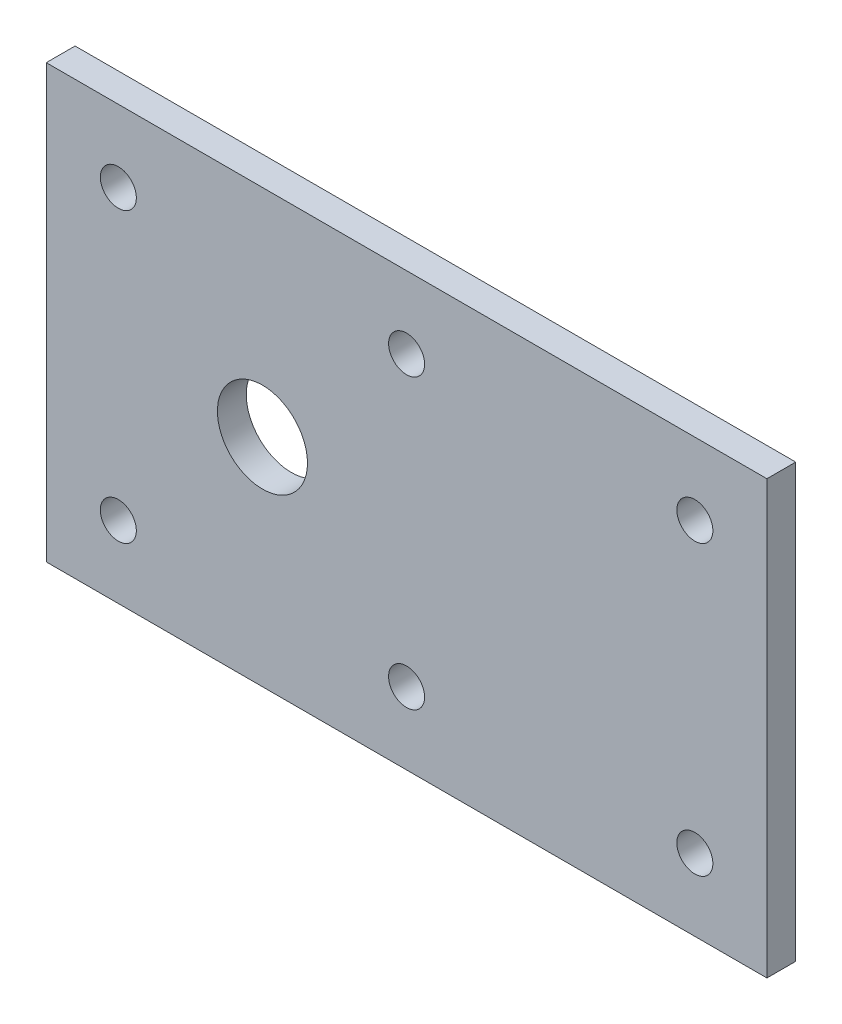
ISO-10303-21;
HEADER;
FILE_DESCRIPTION(('STEP AP214'),'2;1');
FILE_NAME('part.step','',(''),(''),'','','');
FILE_SCHEMA(('AUTOMOTIVE_DESIGN { 1 0 10303 214 1 1 1 1 }'));
ENDSEC;
DATA;
#1=APPLICATION_CONTEXT('core data for automotive mechanical design processes');
#2=APPLICATION_PROTOCOL_DEFINITION('international standard','automotive_design',2000,#1);
#3=PRODUCT_CONTEXT('',#1,'mechanical');
#4=PRODUCT('Part','Part','',(#3));
#5=PRODUCT_RELATED_PRODUCT_CATEGORY('part','',(#4));
#6=PRODUCT_DEFINITION_FORMATION('','',#4);
#7=PRODUCT_DEFINITION_CONTEXT('part definition',#1,'design');
#8=PRODUCT_DEFINITION('design','',#6,#7);
#9=PRODUCT_DEFINITION_SHAPE('','',#8);
#10=(LENGTH_UNIT() NAMED_UNIT(*) SI_UNIT(.MILLI.,.METRE.));
#11=(NAMED_UNIT(*) PLANE_ANGLE_UNIT() SI_UNIT($,.RADIAN.));
#12=(NAMED_UNIT(*) SI_UNIT($,.STERADIAN.) SOLID_ANGLE_UNIT());
#13=UNCERTAINTY_MEASURE_WITH_UNIT(LENGTH_MEASURE(1.E-05),#10,'distance_accuracy_value','');
#14=(GEOMETRIC_REPRESENTATION_CONTEXT(3) GLOBAL_UNCERTAINTY_ASSIGNED_CONTEXT((#13)) GLOBAL_UNIT_ASSIGNED_CONTEXT((#10,
#11,#12)) REPRESENTATION_CONTEXT('',''));
#15=CARTESIAN_POINT('',(0.,0.,0.));
#16=DIRECTION('',(0.,0.,1.));
#17=DIRECTION('',(1.,0.,0.));
#18=AXIS2_PLACEMENT_3D('',#15,#16,#17);
#19=CARTESIAN_POINT('',(120.,-40.,0.));
#20=DIRECTION('',(0.,0.,1.));
#21=DIRECTION('',(1.,0.,0.));
#22=AXIS2_PLACEMENT_3D('',#19,#20,#21);
#23=CYLINDRICAL_SURFACE('',#22,5.);
#24=CARTESIAN_POINT('',(120.,-40.,0.));
#25=DIRECTION('',(0.,0.,1.));
#26=DIRECTION('',(1.,0.,0.));
#27=AXIS2_PLACEMENT_3D('',#24,#25,#26);
#28=CIRCLE('',#27,5.);
#29=CARTESIAN_POINT('',(125.,-40.,0.));
#30=VERTEX_POINT('',#29);
#31=EDGE_CURVE('E41',#30,#30,#28,.T.);
#32=ORIENTED_EDGE('',*,*,#31,.F.);
#33=EDGE_LOOP('',(#32));
#34=FACE_BOUND('',#33,.T.);
#35=CARTESIAN_POINT('',(120.,-40.,8.));
#36=DIRECTION('',(0.,0.,1.));
#37=DIRECTION('',(1.,0.,0.));
#38=AXIS2_PLACEMENT_3D('',#35,#36,#37);
#39=CIRCLE('',#38,5.);
#40=CARTESIAN_POINT('',(125.,-40.,8.));
#41=VERTEX_POINT('',#40);
#42=EDGE_CURVE('E11',#41,#41,#39,.T.);
#43=ORIENTED_EDGE('',*,*,#42,.T.);
#44=EDGE_LOOP('',(#43));
#45=FACE_BOUND('',#44,.T.);
#46=ADVANCED_FACE('F33',(#34,#45),#23,.F.);
#47=CARTESIAN_POINT('',(40.,-40.,0.));
#48=DIRECTION('',(0.,0.,1.));
#49=DIRECTION('',(1.,0.,0.));
#50=AXIS2_PLACEMENT_3D('',#47,#48,#49);
#51=CYLINDRICAL_SURFACE('',#50,5.);
#52=CARTESIAN_POINT('',(40.,-40.,0.));
#53=DIRECTION('',(0.,0.,1.));
#54=DIRECTION('',(1.,0.,0.));
#55=AXIS2_PLACEMENT_3D('',#52,#53,#54);
#56=CIRCLE('',#55,5.);
#57=CARTESIAN_POINT('',(45.,-40.,0.));
#58=VERTEX_POINT('',#57);
#59=EDGE_CURVE('E123',#58,#58,#56,.T.);
#60=ORIENTED_EDGE('',*,*,#59,.F.);
#61=EDGE_LOOP('',(#60));
#62=FACE_BOUND('',#61,.T.);
#63=CARTESIAN_POINT('',(40.,-40.,8.));
#64=DIRECTION('',(0.,0.,1.));
#65=DIRECTION('',(1.,0.,0.));
#66=AXIS2_PLACEMENT_3D('',#63,#64,#65);
#67=CIRCLE('',#66,5.);
#68=CARTESIAN_POINT('',(45.,-40.,8.));
#69=VERTEX_POINT('',#68);
#70=EDGE_CURVE('E126',#69,#69,#67,.T.);
#71=ORIENTED_EDGE('',*,*,#70,.T.);
#72=EDGE_LOOP('',(#71));
#73=FACE_BOUND('',#72,.T.);
#74=ADVANCED_FACE('F135',(#62,#73),#51,.F.);
#75=CARTESIAN_POINT('',(-40.,-40.,0.));
#76=DIRECTION('',(0.,0.,1.));
#77=DIRECTION('',(1.,0.,0.));
#78=AXIS2_PLACEMENT_3D('',#75,#76,#77);
#79=CYLINDRICAL_SURFACE('',#78,5.);
#80=CARTESIAN_POINT('',(-40.,-40.,0.));
#81=DIRECTION('',(0.,0.,1.));
#82=DIRECTION('',(1.,0.,0.));
#83=AXIS2_PLACEMENT_3D('',#80,#81,#82);
#84=CIRCLE('',#83,5.);
#85=CARTESIAN_POINT('',(-35.,-40.,0.));
#86=VERTEX_POINT('',#85);
#87=EDGE_CURVE('E117',#86,#86,#84,.T.);
#88=ORIENTED_EDGE('',*,*,#87,.F.);
#89=EDGE_LOOP('',(#88));
#90=FACE_BOUND('',#89,.T.);
#91=CARTESIAN_POINT('',(-40.,-40.,8.));
#92=DIRECTION('',(0.,0.,1.));
#93=DIRECTION('',(1.,0.,0.));
#94=AXIS2_PLACEMENT_3D('',#91,#92,#93);
#95=CIRCLE('',#94,5.);
#96=CARTESIAN_POINT('',(-35.,-40.,8.));
#97=VERTEX_POINT('',#96);
#98=EDGE_CURVE('E120',#97,#97,#95,.T.);
#99=ORIENTED_EDGE('',*,*,#98,.T.);
#100=EDGE_LOOP('',(#99));
#101=FACE_BOUND('',#100,.T.);
#102=ADVANCED_FACE('F166',(#90,#101),#79,.F.);
#103=CARTESIAN_POINT('',(120.,40.,0.));
#104=DIRECTION('',(0.,0.,1.));
#105=DIRECTION('',(1.,0.,0.));
#106=AXIS2_PLACEMENT_3D('',#103,#104,#105);
#107=CYLINDRICAL_SURFACE('',#106,5.);
#108=CARTESIAN_POINT('',(120.,40.,0.));
#109=DIRECTION('',(0.,0.,1.));
#110=DIRECTION('',(1.,0.,0.));
#111=AXIS2_PLACEMENT_3D('',#108,#109,#110);
#112=CIRCLE('',#111,5.);
#113=CARTESIAN_POINT('',(125.,40.,0.));
#114=VERTEX_POINT('',#113);
#115=EDGE_CURVE('E111',#114,#114,#112,.T.);
#116=ORIENTED_EDGE('',*,*,#115,.F.);
#117=EDGE_LOOP('',(#116));
#118=FACE_BOUND('',#117,.T.);
#119=CARTESIAN_POINT('',(120.,40.,8.));
#120=DIRECTION('',(0.,0.,1.));
#121=DIRECTION('',(1.,0.,0.));
#122=AXIS2_PLACEMENT_3D('',#119,#120,#121);
#123=CIRCLE('',#122,5.);
#124=CARTESIAN_POINT('',(125.,40.,8.));
#125=VERTEX_POINT('',#124);
#126=EDGE_CURVE('E114',#125,#125,#123,.T.);
#127=ORIENTED_EDGE('',*,*,#126,.T.);
#128=EDGE_LOOP('',(#127));
#129=FACE_BOUND('',#128,.T.);
#130=ADVANCED_FACE('F162',(#118,#129),#107,.F.);
#131=CARTESIAN_POINT('',(-60.0000000000001,60.0000000000001,8.));
#132=DIRECTION('',(1.,0.,0.));
#133=DIRECTION('',(0.,0.,-1.));
#134=AXIS2_PLACEMENT_3D('',#131,#132,#133);
#135=PLANE('',#134);
#136=DIRECTION('',(0.,-1.,0.));
#137=VECTOR('',#136,1.);
#138=CARTESIAN_POINT('',(-60.0000000000001,60.0000000000001,0.));
#139=LINE('',#138,#137);
#140=CARTESIAN_POINT('',(-60.0000000000001,60.0000000000001,0.));
#141=VERTEX_POINT('',#140);
#142=CARTESIAN_POINT('',(-60.0000000000001,-60.0000000000001,0.));
#143=VERTEX_POINT('',#142);
#144=EDGE_CURVE('E101',#141,#143,#139,.T.);
#145=ORIENTED_EDGE('',*,*,#144,.T.);
#146=DIRECTION('',(0.,0.,-1.));
#147=VECTOR('',#146,1.);
#148=CARTESIAN_POINT('',(-60.0000000000001,-60.0000000000001,8.));
#149=LINE('',#148,#147);
#150=CARTESIAN_POINT('',(-60.0000000000001,-60.0000000000001,8.));
#151=VERTEX_POINT('',#150);
#152=EDGE_CURVE('E92',#151,#143,#149,.T.);
#153=ORIENTED_EDGE('',*,*,#152,.F.);
#154=DIRECTION('',(0.,-1.,0.));
#155=VECTOR('',#154,1.);
#156=CARTESIAN_POINT('',(-60.0000000000001,60.0000000000001,8.));
#157=LINE('',#156,#155);
#158=CARTESIAN_POINT('',(-60.0000000000001,60.0000000000001,8.));
#159=VERTEX_POINT('',#158);
#160=EDGE_CURVE('E86',#159,#151,#157,.T.);
#161=ORIENTED_EDGE('',*,*,#160,.F.);
#162=DIRECTION('',(0.,0.,-1.));
#163=VECTOR('',#162,1.);
#164=CARTESIAN_POINT('',(-60.0000000000001,60.0000000000001,8.));
#165=LINE('',#164,#163);
#166=EDGE_CURVE('E97',#159,#141,#165,.T.);
#167=ORIENTED_EDGE('',*,*,#166,.T.);
#168=EDGE_LOOP('',(#145,#153,#161,#167));
#169=FACE_BOUND('',#168,.T.);
#170=ADVANCED_FACE('F159',(#169),#135,.F.);
#171=CARTESIAN_POINT('',(-60.0000000000001,-60.0000000000001,8.));
#172=DIRECTION('',(0.,1.,0.));
#173=DIRECTION('',(0.,0.,1.));
#174=AXIS2_PLACEMENT_3D('',#171,#172,#173);
#175=PLANE('',#174);
#176=DIRECTION('',(1.,0.,0.));
#177=VECTOR('',#176,1.);
#178=CARTESIAN_POINT('',(-60.0000000000001,-60.0000000000001,0.));
#179=LINE('',#178,#177);
#180=CARTESIAN_POINT('',(140.,-60.0000000000001,0.));
#181=VERTEX_POINT('',#180);
#182=EDGE_CURVE('E91',#143,#181,#179,.T.);
#183=ORIENTED_EDGE('',*,*,#182,.T.);
#184=DIRECTION('',(0.,0.,-1.));
#185=VECTOR('',#184,1.);
#186=CARTESIAN_POINT('',(140.,-60.0000000000001,8.));
#187=LINE('',#186,#185);
#188=CARTESIAN_POINT('',(140.,-60.0000000000001,8.));
#189=VERTEX_POINT('',#188);
#190=EDGE_CURVE('E89',#189,#181,#187,.T.);
#191=ORIENTED_EDGE('',*,*,#190,.F.);
#192=DIRECTION('',(1.,0.,0.));
#193=VECTOR('',#192,1.);
#194=CARTESIAN_POINT('',(-60.0000000000001,-60.0000000000001,8.));
#195=LINE('',#194,#193);
#196=EDGE_CURVE('E80',#151,#189,#195,.T.);
#197=ORIENTED_EDGE('',*,*,#196,.F.);
#198=ORIENTED_EDGE('',*,*,#152,.T.);
#199=EDGE_LOOP('',(#183,#191,#197,#198));
#200=FACE_BOUND('',#199,.T.);
#201=ADVANCED_FACE('F90',(#200),#175,.F.);
#202=CARTESIAN_POINT('',(140.,60.0000000000001,8.));
#203=DIRECTION('',(-1.,0.,0.));
#204=DIRECTION('',(0.,0.,1.));
#205=AXIS2_PLACEMENT_3D('',#202,#203,#204);
#206=PLANE('',#205);
#207=DIRECTION('',(0.,1.,0.));
#208=VECTOR('',#207,1.);
#209=CARTESIAN_POINT('',(140.,60.0000000000001,0.));
#210=LINE('',#209,#208);
#211=CARTESIAN_POINT('',(140.,60.0000000000001,0.));
#212=VERTEX_POINT('',#211);
#213=EDGE_CURVE('E66',#181,#212,#210,.T.);
#214=ORIENTED_EDGE('',*,*,#213,.T.);
#215=DIRECTION('',(0.,0.,-1.));
#216=VECTOR('',#215,1.);
#217=CARTESIAN_POINT('',(140.,60.0000000000001,8.));
#218=LINE('',#217,#216);
#219=CARTESIAN_POINT('',(140.,60.0000000000001,8.));
#220=VERTEX_POINT('',#219);
#221=EDGE_CURVE('E93',#220,#212,#218,.T.);
#222=ORIENTED_EDGE('',*,*,#221,.F.);
#223=DIRECTION('',(0.,1.,0.));
#224=VECTOR('',#223,1.);
#225=CARTESIAN_POINT('',(140.,60.0000000000001,8.));
#226=LINE('',#225,#224);
#227=EDGE_CURVE('E84',#189,#220,#226,.T.);
#228=ORIENTED_EDGE('',*,*,#227,.F.);
#229=ORIENTED_EDGE('',*,*,#190,.T.);
#230=EDGE_LOOP('',(#214,#222,#228,#229));
#231=FACE_BOUND('',#230,.T.);
#232=ADVANCED_FACE('F95',(#231),#206,.F.);
#233=CARTESIAN_POINT('',(-60.0000000000001,60.0000000000001,8.));
#234=DIRECTION('',(0.,-1.,0.));
#235=DIRECTION('',(0.,0.,-1.));
#236=AXIS2_PLACEMENT_3D('',#233,#234,#235);
#237=PLANE('',#236);
#238=DIRECTION('',(-1.,0.,0.));
#239=VECTOR('',#238,1.);
#240=CARTESIAN_POINT('',(-60.0000000000001,60.0000000000001,0.));
#241=LINE('',#240,#239);
#242=EDGE_CURVE('E72',#212,#141,#241,.T.);
#243=ORIENTED_EDGE('',*,*,#242,.T.);
#244=ORIENTED_EDGE('',*,*,#166,.F.);
#245=DIRECTION('',(-1.,0.,0.));
#246=VECTOR('',#245,1.);
#247=CARTESIAN_POINT('',(-60.0000000000001,60.0000000000001,8.));
#248=LINE('',#247,#246);
#249=EDGE_CURVE('E49',#220,#159,#248,.T.);
#250=ORIENTED_EDGE('',*,*,#249,.F.);
#251=ORIENTED_EDGE('',*,*,#221,.T.);
#252=EDGE_LOOP('',(#243,#244,#250,#251));
#253=FACE_BOUND('',#252,.T.);
#254=ADVANCED_FACE('F139',(#253),#237,.F.);
#255=CARTESIAN_POINT('',(0.,0.,8.));
#256=DIRECTION('',(0.,0.,1.));
#257=DIRECTION('',(1.,0.,0.));
#258=AXIS2_PLACEMENT_3D('',#255,#256,#257);
#259=PLANE('',#258);
#260=CARTESIAN_POINT('',(0.,0.,8.));
#261=DIRECTION('',(0.,0.,1.));
#262=DIRECTION('',(1.,0.,0.));
#263=AXIS2_PLACEMENT_3D('',#260,#261,#262);
#264=CIRCLE('',#263,12.5);
#265=CARTESIAN_POINT('',(12.5,0.,8.));
#266=VERTEX_POINT('',#265);
#267=EDGE_CURVE('E261',#266,#266,#264,.T.);
#268=ORIENTED_EDGE('',*,*,#267,.F.);
#269=EDGE_LOOP('',(#268));
#270=FACE_BOUND('',#269,.T.);
#271=CARTESIAN_POINT('',(40.,40.,8.));
#272=DIRECTION('',(0.,0.,1.));
#273=DIRECTION('',(1.,0.,0.));
#274=AXIS2_PLACEMENT_3D('',#271,#272,#273);
#275=CIRCLE('',#274,5.);
#276=CARTESIAN_POINT('',(45.,40.,8.));
#277=VERTEX_POINT('',#276);
#278=EDGE_CURVE('E268',#277,#277,#275,.T.);
#279=ORIENTED_EDGE('',*,*,#278,.F.);
#280=EDGE_LOOP('',(#279));
#281=FACE_BOUND('',#280,.T.);
#282=CARTESIAN_POINT('',(-40.,40.,8.));
#283=DIRECTION('',(0.,0.,1.));
#284=DIRECTION('',(1.,0.,0.));
#285=AXIS2_PLACEMENT_3D('',#282,#283,#284);
#286=CIRCLE('',#285,5.);
#287=CARTESIAN_POINT('',(-35.,40.,8.));
#288=VERTEX_POINT('',#287);
#289=EDGE_CURVE('E271',#288,#288,#286,.T.);
#290=ORIENTED_EDGE('',*,*,#289,.F.);
#291=EDGE_LOOP('',(#290));
#292=FACE_BOUND('',#291,.T.);
#293=ORIENTED_EDGE('',*,*,#160,.T.);
#294=ORIENTED_EDGE('',*,*,#196,.T.);
#295=ORIENTED_EDGE('',*,*,#227,.T.);
#296=ORIENTED_EDGE('',*,*,#249,.T.);
#297=EDGE_LOOP('',(#293,#294,#295,#296));
#298=FACE_BOUND('',#297,.T.);
#299=ORIENTED_EDGE('',*,*,#126,.F.);
#300=EDGE_LOOP('',(#299));
#301=FACE_BOUND('',#300,.T.);
#302=ORIENTED_EDGE('',*,*,#98,.F.);
#303=EDGE_LOOP('',(#302));
#304=FACE_BOUND('',#303,.T.);
#305=ORIENTED_EDGE('',*,*,#70,.F.);
#306=EDGE_LOOP('',(#305));
#307=FACE_BOUND('',#306,.T.);
#308=ORIENTED_EDGE('',*,*,#42,.F.);
#309=EDGE_LOOP('',(#308));
#310=FACE_BOUND('',#309,.T.);
#311=ADVANCED_FACE('F81',(#270,#281,#292,#298,#301,#304,#307,#310),#259,.T.);
#312=CARTESIAN_POINT('',(0.,0.,0.));
#313=DIRECTION('',(0.,0.,1.));
#314=DIRECTION('',(1.,0.,0.));
#315=AXIS2_PLACEMENT_3D('',#312,#313,#314);
#316=PLANE('',#315);
#317=CARTESIAN_POINT('',(0.,0.,0.));
#318=DIRECTION('',(0.,0.,1.));
#319=DIRECTION('',(1.,0.,0.));
#320=AXIS2_PLACEMENT_3D('',#317,#318,#319);
#321=CIRCLE('',#320,12.5);
#322=CARTESIAN_POINT('',(12.5,0.,0.));
#323=VERTEX_POINT('',#322);
#324=EDGE_CURVE('E259',#323,#323,#321,.T.);
#325=ORIENTED_EDGE('',*,*,#324,.T.);
#326=EDGE_LOOP('',(#325));
#327=FACE_BOUND('',#326,.T.);
#328=CARTESIAN_POINT('',(40.,40.,0.));
#329=DIRECTION('',(0.,0.,1.));
#330=DIRECTION('',(1.,0.,0.));
#331=AXIS2_PLACEMENT_3D('',#328,#329,#330);
#332=CIRCLE('',#331,5.);
#333=CARTESIAN_POINT('',(45.,40.,0.));
#334=VERTEX_POINT('',#333);
#335=EDGE_CURVE('E263',#334,#334,#332,.T.);
#336=ORIENTED_EDGE('',*,*,#335,.T.);
#337=EDGE_LOOP('',(#336));
#338=FACE_BOUND('',#337,.T.);
#339=CARTESIAN_POINT('',(-40.,40.,0.));
#340=DIRECTION('',(0.,0.,1.));
#341=DIRECTION('',(1.,0.,0.));
#342=AXIS2_PLACEMENT_3D('',#339,#340,#341);
#343=CIRCLE('',#342,5.);
#344=CARTESIAN_POINT('',(-35.,40.,0.));
#345=VERTEX_POINT('',#344);
#346=EDGE_CURVE('E104',#345,#345,#343,.T.);
#347=ORIENTED_EDGE('',*,*,#346,.T.);
#348=EDGE_LOOP('',(#347));
#349=FACE_BOUND('',#348,.T.);
#350=ORIENTED_EDGE('',*,*,#144,.F.);
#351=ORIENTED_EDGE('',*,*,#242,.F.);
#352=ORIENTED_EDGE('',*,*,#213,.F.);
#353=ORIENTED_EDGE('',*,*,#182,.F.);
#354=EDGE_LOOP('',(#350,#351,#352,#353));
#355=FACE_BOUND('',#354,.T.);
#356=ORIENTED_EDGE('',*,*,#115,.T.);
#357=EDGE_LOOP('',(#356));
#358=FACE_BOUND('',#357,.T.);
#359=ORIENTED_EDGE('',*,*,#87,.T.);
#360=EDGE_LOOP('',(#359));
#361=FACE_BOUND('',#360,.T.);
#362=ORIENTED_EDGE('',*,*,#59,.T.);
#363=EDGE_LOOP('',(#362));
#364=FACE_BOUND('',#363,.T.);
#365=ORIENTED_EDGE('',*,*,#31,.T.);
#366=EDGE_LOOP('',(#365));
#367=FACE_BOUND('',#366,.T.);
#368=ADVANCED_FACE('F131',(#327,#338,#349,#355,#358,#361,#364,#367),#316,.F.);
#369=CARTESIAN_POINT('',(-40.,40.,0.));
#370=DIRECTION('',(0.,0.,1.));
#371=DIRECTION('',(1.,0.,0.));
#372=AXIS2_PLACEMENT_3D('',#369,#370,#371);
#373=CYLINDRICAL_SURFACE('',#372,5.);
#374=ORIENTED_EDGE('',*,*,#346,.F.);
#375=EDGE_LOOP('',(#374));
#376=FACE_BOUND('',#375,.T.);
#377=ORIENTED_EDGE('',*,*,#289,.T.);
#378=EDGE_LOOP('',(#377));
#379=FACE_BOUND('',#378,.T.);
#380=ADVANCED_FACE('F146',(#376,#379),#373,.F.);
#381=CARTESIAN_POINT('',(40.,40.,0.));
#382=DIRECTION('',(0.,0.,1.));
#383=DIRECTION('',(1.,0.,0.));
#384=AXIS2_PLACEMENT_3D('',#381,#382,#383);
#385=CYLINDRICAL_SURFACE('',#384,5.);
#386=ORIENTED_EDGE('',*,*,#335,.F.);
#387=EDGE_LOOP('',(#386));
#388=FACE_BOUND('',#387,.T.);
#389=ORIENTED_EDGE('',*,*,#278,.T.);
#390=EDGE_LOOP('',(#389));
#391=FACE_BOUND('',#390,.T.);
#392=ADVANCED_FACE('F215',(#388,#391),#385,.F.);
#393=CARTESIAN_POINT('',(0.,0.,0.));
#394=DIRECTION('',(0.,0.,1.));
#395=DIRECTION('',(1.,0.,0.));
#396=AXIS2_PLACEMENT_3D('',#393,#394,#395);
#397=CYLINDRICAL_SURFACE('',#396,12.5);
#398=ORIENTED_EDGE('',*,*,#324,.F.);
#399=EDGE_LOOP('',(#398));
#400=FACE_BOUND('',#399,.T.);
#401=ORIENTED_EDGE('',*,*,#267,.T.);
#402=EDGE_LOOP('',(#401));
#403=FACE_BOUND('',#402,.T.);
#404=ADVANCED_FACE('F236',(#400,#403),#397,.F.);
#405=CLOSED_SHELL('',(#46,#74,#102,#130,#170,#201,#232,#254,#311,#368,#380,#392,#404));
#406=MANIFOLD_SOLID_BREP('B2',#405);
#407=ADVANCED_BREP_SHAPE_REPRESENTATION('',(#18,#406),#14);
#408=SHAPE_DEFINITION_REPRESENTATION(#9,#407);
ENDSEC;
END-ISO-10303-21;
